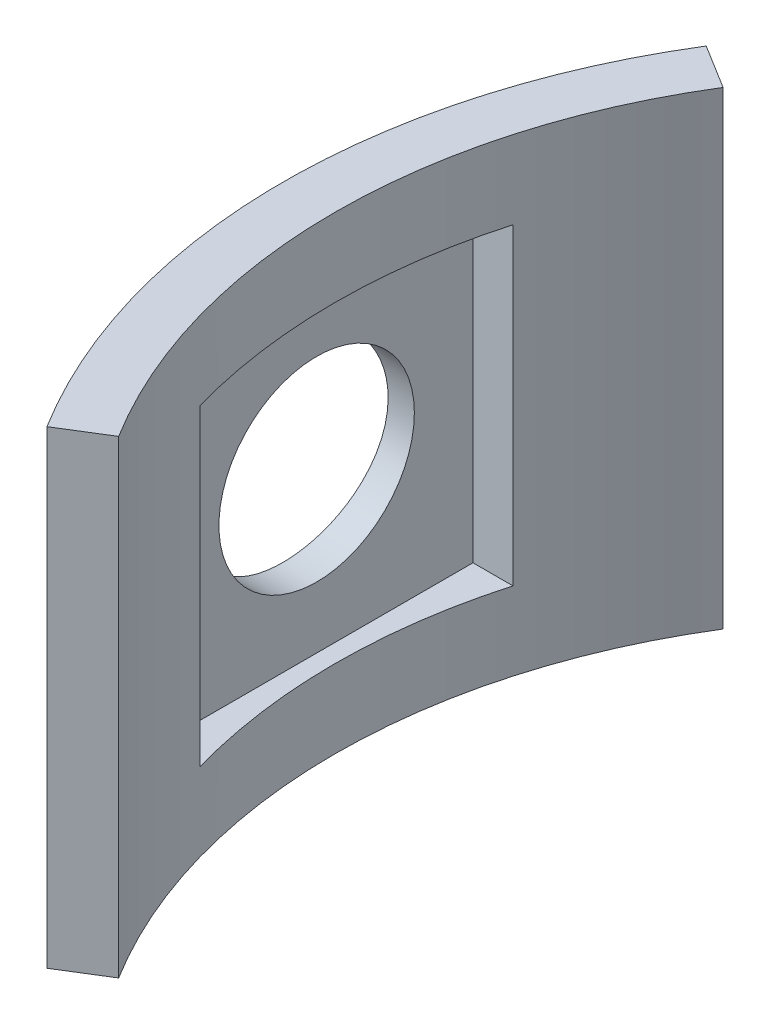
ISO-10303-21;
HEADER;
FILE_DESCRIPTION(('STEP AP214'),'2;1');
FILE_NAME('part.step','',(''),(''),'','','');
FILE_SCHEMA(('AUTOMOTIVE_DESIGN { 1 0 10303 214 1 1 1 1 }'));
ENDSEC;
DATA;
#1=APPLICATION_CONTEXT('core data for automotive mechanical design processes');
#2=APPLICATION_PROTOCOL_DEFINITION('international standard','automotive_design',2000,#1);
#3=PRODUCT_CONTEXT('',#1,'mechanical');
#4=PRODUCT('Part','Part','',(#3));
#5=PRODUCT_RELATED_PRODUCT_CATEGORY('part','',(#4));
#6=PRODUCT_DEFINITION_FORMATION('','',#4);
#7=PRODUCT_DEFINITION_CONTEXT('part definition',#1,'design');
#8=PRODUCT_DEFINITION('design','',#6,#7);
#9=PRODUCT_DEFINITION_SHAPE('','',#8);
#10=(LENGTH_UNIT() NAMED_UNIT(*) SI_UNIT(.MILLI.,.METRE.));
#11=(NAMED_UNIT(*) PLANE_ANGLE_UNIT() SI_UNIT($,.RADIAN.));
#12=(NAMED_UNIT(*) SI_UNIT($,.STERADIAN.) SOLID_ANGLE_UNIT());
#13=UNCERTAINTY_MEASURE_WITH_UNIT(LENGTH_MEASURE(1.E-05),#10,'distance_accuracy_value','');
#14=(GEOMETRIC_REPRESENTATION_CONTEXT(3) GLOBAL_UNCERTAINTY_ASSIGNED_CONTEXT((#13)) GLOBAL_UNIT_ASSIGNED_CONTEXT((#10,
#11,#12)) REPRESENTATION_CONTEXT('',''));
#15=CARTESIAN_POINT('',(0.,0.,0.));
#16=DIRECTION('',(0.,0.,1.));
#17=DIRECTION('',(1.,0.,0.));
#18=AXIS2_PLACEMENT_3D('',#15,#16,#17);
#19=CARTESIAN_POINT('',(-1.70037795283561,11.,3.55239062475205));
#20=DIRECTION('',(-0.526407432663339,0.,0.850232447532316));
#21=DIRECTION('',(0.,1.,0.));
#22=AXIS2_PLACEMENT_3D('',#19,#20,#21);
#23=PLANE('',#22);
#24=DIRECTION('',(-0.850232447532316,0.,-0.526407432663339));
#25=VECTOR('',#24,1.);
#26=CARTESIAN_POINT('',(-1.70037795283561,20.,3.55239062475204));
#27=LINE('',#26,#25);
#28=CARTESIAN_POINT('',(-1.70037795283561,20.,3.55239062475204));
#29=VERTEX_POINT('',#28);
#30=CARTESIAN_POINT('',(-3.40084284790024,20.,2.49957575942536));
#31=VERTEX_POINT('',#30);
#32=EDGE_CURVE('E139',#29,#31,#27,.T.);
#33=ORIENTED_EDGE('',*,*,#32,.F.);
#34=DIRECTION('',(0.,1.,0.));
#35=VECTOR('',#34,1.);
#36=CARTESIAN_POINT('',(-1.70037795283561,0.,3.55239062475205));
#37=LINE('',#36,#35);
#38=CARTESIAN_POINT('',(-1.70037795283561,2.,3.55239062475204));
#39=VERTEX_POINT('',#38);
#40=EDGE_CURVE('E131',#29,#39,#37,.F.);
#41=ORIENTED_EDGE('',*,*,#40,.T.);
#42=DIRECTION('',(-0.850232447532316,0.,-0.526407432663339));
#43=VECTOR('',#42,1.);
#44=CARTESIAN_POINT('',(-1.70037795283561,2.,3.55239062475204));
#45=LINE('',#44,#43);
#46=CARTESIAN_POINT('',(-3.40084284790024,2.,2.49957575942536));
#47=VERTEX_POINT('',#46);
#48=EDGE_CURVE('E116',#39,#47,#45,.T.);
#49=ORIENTED_EDGE('',*,*,#48,.T.);
#50=DIRECTION('',(0.,1.,0.));
#51=VECTOR('',#50,1.);
#52=CARTESIAN_POINT('',(-3.40084284790024,0.,2.49957575942536));
#53=LINE('',#52,#51);
#54=EDGE_CURVE('E180',#31,#47,#53,.F.);
#55=ORIENTED_EDGE('',*,*,#54,.F.);
#56=EDGE_LOOP('',(#33,#41,#49,#55));
#57=FACE_BOUND('',#56,.T.);
#58=ADVANCED_FACE('F61',(#57),#23,.F.);
#59=CARTESIAN_POINT('',(17.0316216216216,2.,15.15));
#60=DIRECTION('',(0.,-1.,0.));
#61=DIRECTION('',(0.,0.,-1.));
#62=AXIS2_PLACEMENT_3D('',#59,#60,#61);
#63=PLANE('',#62);
#64=ORIENTED_EDGE('',*,*,#48,.F.);
#65=CARTESIAN_POINT('',(17.0316216216216,2.,15.15));
#66=DIRECTION('',(0.,1.,0.));
#67=DIRECTION('',(0.,0.,1.));
#68=AXIS2_PLACEMENT_3D('',#65,#66,#67);
#69=CIRCLE('',#68,22.0316216216216);
#70=CARTESIAN_POINT('',(-1.70037795283566,2.,26.7476093752479));
#71=VERTEX_POINT('',#70);
#72=EDGE_CURVE('E124',#39,#71,#69,.T.);
#73=ORIENTED_EDGE('',*,*,#72,.T.);
#74=DIRECTION('',(-0.850232447532318,0.,0.526407432663336));
#75=VECTOR('',#74,1.);
#76=CARTESIAN_POINT('',(-1.70037795283566,2.,26.7476093752479));
#77=LINE('',#76,#75);
#78=CARTESIAN_POINT('',(-3.4008428479003,2.,27.8004242405745));
#79=VERTEX_POINT('',#78);
#80=EDGE_CURVE('E85',#71,#79,#77,.T.);
#81=ORIENTED_EDGE('',*,*,#80,.T.);
#82=CARTESIAN_POINT('',(17.0316216216216,2.,15.15));
#83=DIRECTION('',(0.,1.,0.));
#84=DIRECTION('',(0.,0.,1.));
#85=AXIS2_PLACEMENT_3D('',#82,#83,#84);
#86=CIRCLE('',#85,24.0316216216216);
#87=EDGE_CURVE('E143',#47,#79,#86,.T.);
#88=ORIENTED_EDGE('',*,*,#87,.F.);
#89=EDGE_LOOP('',(#64,#73,#81,#88));
#90=FACE_BOUND('',#89,.T.);
#91=ADVANCED_FACE('F129',(#90),#63,.T.);
#92=CARTESIAN_POINT('',(-1.70037795283566,11.,26.7476093752479));
#93=DIRECTION('',(0.526407432663335,0.,0.850232447532318));
#94=DIRECTION('',(0.,1.,0.));
#95=AXIS2_PLACEMENT_3D('',#92,#93,#94);
#96=PLANE('',#95);
#97=ORIENTED_EDGE('',*,*,#80,.F.);
#98=DIRECTION('',(0.,1.,0.));
#99=VECTOR('',#98,1.);
#100=CARTESIAN_POINT('',(-1.70037795283566,0.,26.7476093752479));
#101=LINE('',#100,#99);
#102=CARTESIAN_POINT('',(-1.70037795283566,20.,26.7476093752479));
#103=VERTEX_POINT('',#102);
#104=EDGE_CURVE('E112',#103,#71,#101,.F.);
#105=ORIENTED_EDGE('',*,*,#104,.F.);
#106=DIRECTION('',(-0.850232447532318,0.,0.526407432663336));
#107=VECTOR('',#106,1.);
#108=CARTESIAN_POINT('',(-1.70037795283566,20.,26.7476093752479));
#109=LINE('',#108,#107);
#110=CARTESIAN_POINT('',(-3.4008428479003,20.,27.8004242405745));
#111=VERTEX_POINT('',#110);
#112=EDGE_CURVE('E117',#103,#111,#109,.T.);
#113=ORIENTED_EDGE('',*,*,#112,.T.);
#114=DIRECTION('',(0.,1.,0.));
#115=VECTOR('',#114,1.);
#116=CARTESIAN_POINT('',(-3.4008428479003,0.,27.8004242405745));
#117=LINE('',#116,#115);
#118=EDGE_CURVE('E114',#111,#79,#117,.F.);
#119=ORIENTED_EDGE('',*,*,#118,.T.);
#120=EDGE_LOOP('',(#97,#105,#113,#119));
#121=FACE_BOUND('',#120,.T.);
#122=ADVANCED_FACE('F111',(#121),#96,.T.);
#123=CARTESIAN_POINT('',(17.0316216216216,20.,15.15));
#124=DIRECTION('',(0.,-1.,0.));
#125=DIRECTION('',(0.,0.,-1.));
#126=AXIS2_PLACEMENT_3D('',#123,#124,#125);
#127=PLANE('',#126);
#128=CARTESIAN_POINT('',(17.0316216216216,20.,15.15));
#129=DIRECTION('',(0.,1.,0.));
#130=DIRECTION('',(0.,0.,1.));
#131=AXIS2_PLACEMENT_3D('',#128,#129,#130);
#132=CIRCLE('',#131,22.0316216216216);
#133=EDGE_CURVE('E126',#103,#29,#132,.F.);
#134=ORIENTED_EDGE('',*,*,#133,.T.);
#135=ORIENTED_EDGE('',*,*,#32,.T.);
#136=CARTESIAN_POINT('',(17.0316216216216,20.,15.15));
#137=DIRECTION('',(0.,1.,0.));
#138=DIRECTION('',(0.,0.,1.));
#139=AXIS2_PLACEMENT_3D('',#136,#137,#138);
#140=CIRCLE('',#139,24.0316216216216);
#141=EDGE_CURVE('E133',#111,#31,#140,.F.);
#142=ORIENTED_EDGE('',*,*,#141,.F.);
#143=ORIENTED_EDGE('',*,*,#112,.F.);
#144=EDGE_LOOP('',(#134,#135,#142,#143));
#145=FACE_BOUND('',#144,.T.);
#146=ADVANCED_FACE('F63',(#145),#127,.F.);
#147=CARTESIAN_POINT('',(17.0316216216216,0.,15.15));
#148=DIRECTION('',(0.,1.,0.));
#149=DIRECTION('',(0.,0.,1.));
#150=AXIS2_PLACEMENT_3D('',#147,#148,#149);
#151=CYLINDRICAL_SURFACE('',#150,24.0316216216216);
#152=CARTESIAN_POINT('',(-7.00000000000002,14.8594363695317,15.1499999999999));
#153=CARTESIAN_POINT('',(-6.99999655580729,14.8594278191294,14.9407237935787));
#154=CARTESIAN_POINT('',(-6.99723773053085,14.8418586012387,14.731328681899));
#155=CARTESIAN_POINT('',(-6.98649779536651,14.7720677339044,14.3183983751198));
#156=CARTESIAN_POINT('',(-6.97851169983006,14.7198130015537,14.1148689682736));
#157=CARTESIAN_POINT('',(-6.95821408159259,14.5822564275529,13.7197051666544));
#158=CARTESIAN_POINT('',(-6.94590592362391,14.4969802878297,13.5280616548588));
#159=CARTESIAN_POINT('',(-6.91832186186237,14.2958659954388,13.161831443948));
#160=CARTESIAN_POINT('',(-6.90304634465155,14.1800318231119,12.9872425274398));
#161=CARTESIAN_POINT('',(-6.87108045702379,13.9200501452206,12.6585786582804));
#162=CARTESIAN_POINT('',(-6.85438028954328,13.7756957983728,12.5046682578808));
#163=CARTESIAN_POINT('',(-6.82152339668183,13.463216627164,12.2231507017537));
#164=CARTESIAN_POINT('',(-6.80536670364534,13.2950903911258,12.095545109226));
#165=CARTESIAN_POINT('',(-6.77533110715115,12.9387254891855,11.8696121313387));
#166=CARTESIAN_POINT('',(-6.76146486559563,12.7503839347235,11.7714452028692));
#167=CARTESIAN_POINT('',(-6.73771472173105,12.3596329374875,11.6082018001967));
#168=CARTESIAN_POINT('',(-6.72783058429605,12.1572243261397,11.543123372202));
#169=CARTESIAN_POINT('',(-6.71326053544492,11.7458204316309,11.4484179970397));
#170=CARTESIAN_POINT('',(-6.70853321241177,11.5368916914294,11.4185084734257));
#171=CARTESIAN_POINT('',(-6.70468648171829,11.1169314710586,11.3941142735021));
#172=CARTESIAN_POINT('',(-6.70556672590644,10.905900122244,11.3996273979417));
#173=CARTESIAN_POINT('',(-6.71279782474923,10.4897285899738,11.4456913377104));
#174=CARTESIAN_POINT('',(-6.71909939096481,10.2845524865723,11.4859264848089));
#175=CARTESIAN_POINT('',(-6.73638605700605,9.88389949087544,11.5997977580143));
#176=CARTESIAN_POINT('',(-6.74737129925535,9.68842289372945,11.6734348998306));
#177=CARTESIAN_POINT('',(-6.77284158082797,9.31176275474877,11.8523452770112));
#178=CARTESIAN_POINT('',(-6.78734125867027,9.13064331500263,11.9577512970786));
#179=CARTESIAN_POINT('',(-6.81819623327134,8.7885427264844,12.1971128782541));
#180=CARTESIAN_POINT('',(-6.83455166162342,8.62756300754604,12.3310704645775));
#181=CARTESIAN_POINT('',(-6.86749264848931,8.32848277326179,12.6254608640565));
#182=CARTESIAN_POINT('',(-6.88407877999428,8.19064913477884,12.7861648834573));
#183=CARTESIAN_POINT('',(-6.91544798433728,7.94386647119987,13.1285645117693));
#184=CARTESIAN_POINT('',(-6.93023104805976,7.83491759212981,13.3102602267967));
#185=CARTESIAN_POINT('',(-6.95634578569965,7.64897968930712,13.6897237733107));
#186=CARTESIAN_POINT('',(-6.96767512157039,7.57201230310816,13.8875023780906));
#187=CARTESIAN_POINT('',(-6.98558664119528,7.45245970192718,14.2933944910236));
#188=CARTESIAN_POINT('',(-6.9921691725376,7.40987196944296,14.5015072412584));
#189=CARTESIAN_POINT('',(-6.9997991285065,7.36064488221151,14.9198578464692));
#190=CARTESIAN_POINT('',(-7.0009030145373,7.35363881506407,15.1300515580904));
#191=CARTESIAN_POINT('',(-6.99760532865194,7.37479905699871,15.5486112251208));
#192=CARTESIAN_POINT('',(-6.99320394162632,7.40296418488207,15.7569772416753));
#193=CARTESIAN_POINT('',(-6.97942517972722,7.49336233849228,16.164848295612));
#194=CARTESIAN_POINT('',(-6.97007405645026,7.55541568802515,16.3643941184797));
#195=CARTESIAN_POINT('',(-6.94744062055987,7.71163861760151,16.7502498144375));
#196=CARTESIAN_POINT('',(-6.93415811036299,7.80580981185834,16.9365590216985));
#197=CARTESIAN_POINT('',(-6.90499677601051,8.02444840004027,17.2922584951851));
#198=CARTESIAN_POINT('',(-6.88909844284686,8.1491471697544,17.4615049118126));
#199=CARTESIAN_POINT('',(-6.85653300446168,8.42498039398976,17.7767996460666));
#200=CARTESIAN_POINT('',(-6.83986585072392,8.57611651851877,17.9228464970989));
#201=CARTESIAN_POINT('',(-6.80746098059078,8.90217113672799,18.1889395063902));
#202=CARTESIAN_POINT('',(-6.79173300844924,9.07729193103016,18.3087391469663));
#203=CARTESIAN_POINT('',(-6.76316314179017,9.44538706384638,18.5172206909178));
#204=CARTESIAN_POINT('',(-6.75032116436418,9.63836088925617,18.6059034882545));
#205=CARTESIAN_POINT('',(-6.72904876686571,10.0359652766824,18.7492565665791));
#206=CARTESIAN_POINT('',(-6.72060186007459,10.240549035596,18.8040541054188));
#207=CARTESIAN_POINT('',(-6.70903302029058,10.6561583200623,18.878484665223));
#208=CARTESIAN_POINT('',(-6.70591068650687,10.8671833595501,18.8981203328945));
#209=CARTESIAN_POINT('',(-6.70536030105771,11.2872263414283,18.9016029767865));
#210=CARTESIAN_POINT('',(-6.70787055571295,11.4962410906892,18.8858376977782));
#211=CARTESIAN_POINT('',(-6.7181680289625,11.9086069377442,18.8197995207883));
#212=CARTESIAN_POINT('',(-6.7259552362329,12.111958047691,18.7695266968569));
#213=CARTESIAN_POINT('',(-6.74590696179683,12.5071018117182,18.6360416698126));
#214=CARTESIAN_POINT('',(-6.75806758324646,12.6989045786663,18.5528587839735));
#215=CARTESIAN_POINT('',(-6.78540032369082,13.0658947561193,18.3559538611391));
#216=CARTESIAN_POINT('',(-6.80057256145383,13.2410815109403,18.2422306196699));
#217=CARTESIAN_POINT('',(-6.83241640321659,13.5718329831786,17.9860731046992));
#218=CARTESIAN_POINT('',(-6.84910197028113,13.7271744731643,17.8433522989495));
#219=CARTESIAN_POINT('',(-6.88197769831655,14.0118388044834,17.5338564258006));
#220=CARTESIAN_POINT('',(-6.89816774357051,14.1411556071127,17.3670757909956));
#221=CARTESIAN_POINT('',(-6.92833957848441,14.3707973851619,17.0130152192384));
#222=CARTESIAN_POINT('',(-6.94230756954949,14.4709441836809,16.8256185507199));
#223=CARTESIAN_POINT('',(-6.96632666802676,14.6381881870025,16.4365297154516));
#224=CARTESIAN_POINT('',(-6.9763817755595,14.7053191623368,16.234852398433));
#225=CARTESIAN_POINT('',(-6.98918219637826,14.7896264577072,15.885259791464));
#226=CARTESIAN_POINT('',(-6.99321774251151,14.8157645001604,15.7394879270202));
#227=CARTESIAN_POINT('',(-6.99862784309518,14.8506723567066,15.4458304966152));
#228=CARTESIAN_POINT('',(-7.00000243482511,14.859442414122,15.2979449602954));
#229=CARTESIAN_POINT('',(-7.00000000000002,14.8594363695317,15.1499999999999));
#230=B_SPLINE_CURVE_WITH_KNOTS('',3,(#152,#153,#154,#155,#156,#157,#158,#159,#160,#161,#162,
#163,#164,#165,#166,#167,#168,#169,#170,#171,#172,#173,#174,#175,#176,#177,#178,#179,#180,#181,
#182,#183,#184,#185,#186,#187,#188,#189,#190,#191,#192,#193,#194,#195,#196,#197,#198,#199,#200,
#201,#202,#203,#204,#205,#206,#207,#208,#209,#210,#211,#212,#213,#214,#215,#216,#217,#218,#219,
#220,#221,#222,#223,#224,#225,#226,#227,#228,#229),.UNSPECIFIED.,.T.,.F.,(4,2,2,2,2,2,2,2,2,2,2,
2,2,2,2,2,2,2,2,2,2,2,2,2,2,2,2,2,2,2,2,2,2,2,2,2,2,2,4),(0.,0.627287951865331,1.25517506987935,
1.8825744565333,2.50989216151006,3.14193852223494,3.77402243237048,4.40949141729267,
5.04492287503385,5.67521307851242,6.30546415016529,6.93004507067763,7.55464498512432,
8.18189262890629,8.80918477933798,9.44327559383011,10.0773696138862,10.7118919438739,
11.3463678057872,11.9742911576812,12.6021934217982,13.2267984054825,13.8514347858659,
14.4809605537274,15.1105261021508,15.7457727282853,16.3810011028104,17.0138291204428,
17.6466095017936,18.2724929179199,18.8983749909565,19.5237007603024,20.1490511953485,
20.7809109201581,21.4129170915182,22.0487064128772,22.6838440518295,23.1273029280975,
23.5707555915396),.UNSPECIFIED.);
#231=CARTESIAN_POINT('',(-7.00000000000002,14.8594363695317,15.1499999999999));
#232=VERTEX_POINT('',#231);
#233=EDGE_CURVE('E206',#232,#232,#230,.T.);
#234=ORIENTED_EDGE('',*,*,#233,.F.);
#235=EDGE_LOOP('',(#234));
#236=FACE_BOUND('',#235,.T.);
#237=ORIENTED_EDGE('',*,*,#118,.F.);
#238=ORIENTED_EDGE('',*,*,#141,.T.);
#239=ORIENTED_EDGE('',*,*,#54,.T.);
#240=ORIENTED_EDGE('',*,*,#87,.T.);
#241=EDGE_LOOP('',(#237,#238,#239,#240));
#242=FACE_BOUND('',#241,.T.);
#243=ADVANCED_FACE('F187',(#236,#242),#151,.T.);
#244=CARTESIAN_POINT('',(17.0316216216216,0.,15.15));
#245=DIRECTION('',(0.,1.,0.));
#246=DIRECTION('',(0.,0.,1.));
#247=AXIS2_PLACEMENT_3D('',#244,#245,#246);
#248=CYLINDRICAL_SURFACE('',#247,22.0316216216216);
#249=CARTESIAN_POINT('',(17.0316216216216,5.00000000000002,15.15));
#250=DIRECTION('',(0.,-1.,0.));
#251=DIRECTION('',(0.,0.,-1.));
#252=AXIS2_PLACEMENT_3D('',#249,#250,#251);
#253=CIRCLE('',#252,22.0316216216216);
#254=CARTESIAN_POINT('',(-4.16725455798527,5.00000000000002,9.14999999999995));
#255=VERTEX_POINT('',#254);
#256=CARTESIAN_POINT('',(-4.1672545579853,5.00000000000002,21.15));
#257=VERTEX_POINT('',#256);
#258=EDGE_CURVE('E141',#255,#257,#253,.F.);
#259=ORIENTED_EDGE('',*,*,#258,.T.);
#260=DIRECTION('',(0.,1.,0.));
#261=VECTOR('',#260,1.);
#262=CARTESIAN_POINT('',(-4.1672545579853,0.,21.15));
#263=LINE('',#262,#261);
#264=CARTESIAN_POINT('',(-4.1672545579853,17.,21.15));
#265=VERTEX_POINT('',#264);
#266=EDGE_CURVE('E12',#257,#265,#263,.T.);
#267=ORIENTED_EDGE('',*,*,#266,.T.);
#268=CARTESIAN_POINT('',(17.0316216216216,17.,15.15));
#269=DIRECTION('',(0.,1.,0.));
#270=DIRECTION('',(0.,0.,1.));
#271=AXIS2_PLACEMENT_3D('',#268,#269,#270);
#272=CIRCLE('',#271,22.0316216216216);
#273=CARTESIAN_POINT('',(-4.16725455798527,17.,9.14999999999996));
#274=VERTEX_POINT('',#273);
#275=EDGE_CURVE('E69',#265,#274,#272,.F.);
#276=ORIENTED_EDGE('',*,*,#275,.T.);
#277=DIRECTION('',(0.,1.,0.));
#278=VECTOR('',#277,1.);
#279=CARTESIAN_POINT('',(-4.16725455798527,0.,9.14999999999995));
#280=LINE('',#279,#278);
#281=EDGE_CURVE('E146',#274,#255,#280,.F.);
#282=ORIENTED_EDGE('',*,*,#281,.T.);
#283=EDGE_LOOP('',(#259,#267,#276,#282));
#284=FACE_BOUND('',#283,.T.);
#285=ORIENTED_EDGE('',*,*,#104,.T.);
#286=ORIENTED_EDGE('',*,*,#72,.F.);
#287=ORIENTED_EDGE('',*,*,#40,.F.);
#288=ORIENTED_EDGE('',*,*,#133,.F.);
#289=EDGE_LOOP('',(#285,#286,#287,#288));
#290=FACE_BOUND('',#289,.T.);
#291=ADVANCED_FACE('F122',(#284,#290),#248,.F.);
#292=CARTESIAN_POINT('',(-5.70037795283565,17.,21.1499999999999));
#293=DIRECTION('',(0.,0.,1.));
#294=DIRECTION('',(1.,0.,0.));
#295=AXIS2_PLACEMENT_3D('',#292,#293,#294);
#296=PLANE('',#295);
#297=DIRECTION('',(1.,0.,0.));
#298=VECTOR('',#297,1.);
#299=CARTESIAN_POINT('',(-5.70037795283565,5.00000000000002,21.1499999999999));
#300=LINE('',#299,#298);
#301=CARTESIAN_POINT('',(-5.70037795283565,5.00000000000002,21.1499999999999));
#302=VERTEX_POINT('',#301);
#303=EDGE_CURVE('E76',#302,#257,#300,.T.);
#304=ORIENTED_EDGE('',*,*,#303,.F.);
#305=DIRECTION('',(0.,-1.,0.));
#306=VECTOR('',#305,1.);
#307=CARTESIAN_POINT('',(-5.70037795283565,17.,21.1499999999999));
#308=LINE('',#307,#306);
#309=CARTESIAN_POINT('',(-5.70037795283565,17.,21.1499999999999));
#310=VERTEX_POINT('',#309);
#311=EDGE_CURVE('E167',#310,#302,#308,.T.);
#312=ORIENTED_EDGE('',*,*,#311,.F.);
#313=DIRECTION('',(1.,0.,0.));
#314=VECTOR('',#313,1.);
#315=CARTESIAN_POINT('',(-5.70037795283565,17.,21.1499999999999));
#316=LINE('',#315,#314);
#317=EDGE_CURVE('E127',#310,#265,#316,.T.);
#318=ORIENTED_EDGE('',*,*,#317,.T.);
#319=ORIENTED_EDGE('',*,*,#266,.F.);
#320=EDGE_LOOP('',(#304,#312,#318,#319));
#321=FACE_BOUND('',#320,.T.);
#322=ADVANCED_FACE('F165',(#321),#296,.F.);
#323=CARTESIAN_POINT('',(-5.70037795283565,17.,21.1499999999999));
#324=DIRECTION('',(0.,1.,0.));
#325=DIRECTION('',(0.,0.,1.));
#326=AXIS2_PLACEMENT_3D('',#323,#324,#325);
#327=PLANE('',#326);
#328=ORIENTED_EDGE('',*,*,#317,.F.);
#329=DIRECTION('',(0.,0.,1.));
#330=VECTOR('',#329,1.);
#331=CARTESIAN_POINT('',(-5.70037795283565,17.,21.1499999999999));
#332=LINE('',#331,#330);
#333=CARTESIAN_POINT('',(-5.70037795283562,17.,9.14999999999995));
#334=VERTEX_POINT('',#333);
#335=EDGE_CURVE('E173',#334,#310,#332,.T.);
#336=ORIENTED_EDGE('',*,*,#335,.F.);
#337=DIRECTION('',(1.,0.,0.));
#338=VECTOR('',#337,1.);
#339=CARTESIAN_POINT('',(-5.70037795283562,17.,9.14999999999995));
#340=LINE('',#339,#338);
#341=EDGE_CURVE('E163',#334,#274,#340,.T.);
#342=ORIENTED_EDGE('',*,*,#341,.T.);
#343=ORIENTED_EDGE('',*,*,#275,.F.);
#344=EDGE_LOOP('',(#328,#336,#342,#343));
#345=FACE_BOUND('',#344,.T.);
#346=ADVANCED_FACE('F158',(#345),#327,.F.);
#347=CARTESIAN_POINT('',(-5.70037795283562,17.,9.14999999999995));
#348=DIRECTION('',(0.,0.,-1.));
#349=DIRECTION('',(-1.,0.,0.));
#350=AXIS2_PLACEMENT_3D('',#347,#348,#349);
#351=PLANE('',#350);
#352=ORIENTED_EDGE('',*,*,#341,.F.);
#353=DIRECTION('',(0.,1.,0.));
#354=VECTOR('',#353,1.);
#355=CARTESIAN_POINT('',(-5.70037795283562,17.,9.14999999999995));
#356=LINE('',#355,#354);
#357=CARTESIAN_POINT('',(-5.70037795283562,5.00000000000002,9.14999999999995));
#358=VERTEX_POINT('',#357);
#359=EDGE_CURVE('E243',#358,#334,#356,.T.);
#360=ORIENTED_EDGE('',*,*,#359,.F.);
#361=DIRECTION('',(1.,0.,0.));
#362=VECTOR('',#361,1.);
#363=CARTESIAN_POINT('',(-5.70037795283562,5.00000000000002,9.14999999999995));
#364=LINE('',#363,#362);
#365=EDGE_CURVE('E170',#358,#255,#364,.T.);
#366=ORIENTED_EDGE('',*,*,#365,.T.);
#367=ORIENTED_EDGE('',*,*,#281,.F.);
#368=EDGE_LOOP('',(#352,#360,#366,#367));
#369=FACE_BOUND('',#368,.T.);
#370=ADVANCED_FACE('F228',(#369),#351,.F.);
#371=CARTESIAN_POINT('',(-5.70037795283565,5.00000000000002,21.1499999999999));
#372=DIRECTION('',(0.,-1.,0.));
#373=DIRECTION('',(0.,0.,-1.));
#374=AXIS2_PLACEMENT_3D('',#371,#372,#373);
#375=PLANE('',#374);
#376=ORIENTED_EDGE('',*,*,#365,.F.);
#377=DIRECTION('',(0.,0.,-1.));
#378=VECTOR('',#377,1.);
#379=CARTESIAN_POINT('',(-5.70037795283565,5.00000000000002,21.1499999999999));
#380=LINE('',#379,#378);
#381=EDGE_CURVE('E239',#302,#358,#380,.T.);
#382=ORIENTED_EDGE('',*,*,#381,.F.);
#383=ORIENTED_EDGE('',*,*,#303,.T.);
#384=ORIENTED_EDGE('',*,*,#258,.F.);
#385=EDGE_LOOP('',(#376,#382,#383,#384));
#386=FACE_BOUND('',#385,.T.);
#387=ADVANCED_FACE('F224',(#386),#375,.F.);
#388=CARTESIAN_POINT('',(-5.7003779528356,0.,0.));
#389=DIRECTION('',(1.,0.,0.));
#390=DIRECTION('',(0.,0.,-1.));
#391=AXIS2_PLACEMENT_3D('',#388,#389,#390);
#392=PLANE('',#391);
#393=CARTESIAN_POINT('',(-5.70037795283564,11.1094363695317,15.15));
#394=DIRECTION('',(1.,0.,0.));
#395=DIRECTION('',(0.,0.,-1.));
#396=AXIS2_PLACEMENT_3D('',#393,#394,#395);
#397=CIRCLE('',#396,3.75);
#398=CARTESIAN_POINT('',(-5.70037795283563,11.1094363695317,11.4));
#399=VERTEX_POINT('',#398);
#400=EDGE_CURVE('E214',#399,#399,#397,.T.);
#401=ORIENTED_EDGE('',*,*,#400,.F.);
#402=EDGE_LOOP('',(#401));
#403=FACE_BOUND('',#402,.T.);
#404=ORIENTED_EDGE('',*,*,#311,.T.);
#405=ORIENTED_EDGE('',*,*,#381,.T.);
#406=ORIENTED_EDGE('',*,*,#359,.T.);
#407=ORIENTED_EDGE('',*,*,#335,.T.);
#408=EDGE_LOOP('',(#404,#405,#406,#407));
#409=FACE_BOUND('',#408,.T.);
#410=ADVANCED_FACE('F220',(#403,#409),#392,.T.);
#411=CARTESIAN_POINT('',(-7.00000000000002,11.1094363695317,15.1499999999999));
#412=DIRECTION('',(1.,0.,0.));
#413=DIRECTION('',(0.,0.,-1.));
#414=AXIS2_PLACEMENT_3D('',#411,#412,#413);
#415=CYLINDRICAL_SURFACE('',#414,3.75);
#416=ORIENTED_EDGE('',*,*,#233,.T.);
#417=EDGE_LOOP('',(#416));
#418=FACE_BOUND('',#417,.T.);
#419=ORIENTED_EDGE('',*,*,#400,.T.);
#420=EDGE_LOOP('',(#419));
#421=FACE_BOUND('',#420,.T.);
#422=ADVANCED_FACE('F216',(#418,#421),#415,.F.);
#423=CLOSED_SHELL('',(#58,#91,#122,#146,#243,#291,#322,#346,#370,#387,#410,#422));
#424=MANIFOLD_SOLID_BREP('B2',#423);
#425=ADVANCED_BREP_SHAPE_REPRESENTATION('',(#18,#424),#14);
#426=SHAPE_DEFINITION_REPRESENTATION(#9,#425);
ENDSEC;
END-ISO-10303-21;
